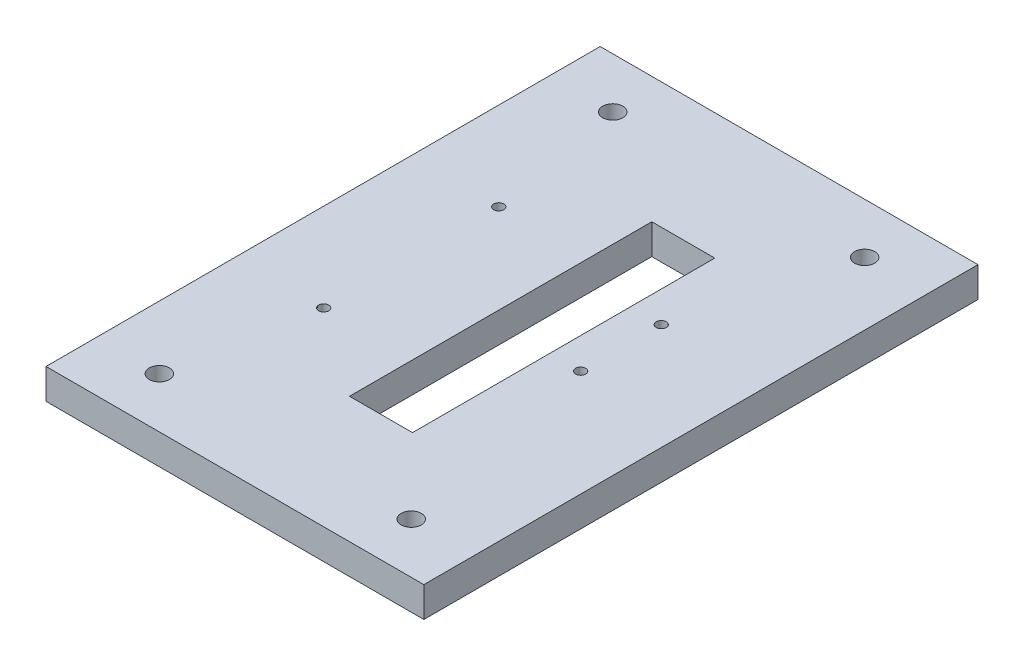
ISO-10303-21;
HEADER;
FILE_DESCRIPTION(('STEP AP214'),'2;1');
FILE_NAME('part.step','',(''),(''),'','','');
FILE_SCHEMA(('AUTOMOTIVE_DESIGN { 1 0 10303 214 1 1 1 1 }'));
ENDSEC;
DATA;
#1=APPLICATION_CONTEXT('core data for automotive mechanical design processes');
#2=APPLICATION_PROTOCOL_DEFINITION('international standard','automotive_design',2000,#1);
#3=PRODUCT_CONTEXT('',#1,'mechanical');
#4=PRODUCT('Part','Part','',(#3));
#5=PRODUCT_RELATED_PRODUCT_CATEGORY('part','',(#4));
#6=PRODUCT_DEFINITION_FORMATION('','',#4);
#7=PRODUCT_DEFINITION_CONTEXT('part definition',#1,'design');
#8=PRODUCT_DEFINITION('design','',#6,#7);
#9=PRODUCT_DEFINITION_SHAPE('','',#8);
#10=(LENGTH_UNIT() NAMED_UNIT(*) SI_UNIT(.MILLI.,.METRE.));
#11=(NAMED_UNIT(*) PLANE_ANGLE_UNIT() SI_UNIT($,.RADIAN.));
#12=(NAMED_UNIT(*) SI_UNIT($,.STERADIAN.) SOLID_ANGLE_UNIT());
#13=UNCERTAINTY_MEASURE_WITH_UNIT(LENGTH_MEASURE(1.E-05),#10,'distance_accuracy_value','');
#14=(GEOMETRIC_REPRESENTATION_CONTEXT(3) GLOBAL_UNCERTAINTY_ASSIGNED_CONTEXT((#13)) GLOBAL_UNIT_ASSIGNED_CONTEXT((#10,
#11,#12)) REPRESENTATION_CONTEXT('',''));
#15=CARTESIAN_POINT('',(0.,0.,0.));
#16=DIRECTION('',(0.,0.,1.));
#17=DIRECTION('',(1.,0.,0.));
#18=AXIS2_PLACEMENT_3D('',#15,#16,#17);
#19=CARTESIAN_POINT('',(20.5,12.,0.));
#20=DIRECTION('',(-1.,0.,0.));
#21=DIRECTION('',(0.,0.,1.));
#22=AXIS2_PLACEMENT_3D('',#19,#20,#21);
#23=PLANE('',#22);
#24=DIRECTION('',(0.,0.,-1.));
#25=VECTOR('',#24,1.);
#26=CARTESIAN_POINT('',(20.5,0.,0.));
#27=LINE('',#26,#25);
#28=CARTESIAN_POINT('',(20.5,0.,60.));
#29=VERTEX_POINT('',#28);
#30=CARTESIAN_POINT('',(20.5,0.,-60.));
#31=VERTEX_POINT('',#30);
#32=EDGE_CURVE('E165',#29,#31,#27,.T.);
#33=ORIENTED_EDGE('',*,*,#32,.F.);
#34=DIRECTION('',(0.,-1.,0.));
#35=VECTOR('',#34,1.);
#36=CARTESIAN_POINT('',(20.5,12.,60.));
#37=LINE('',#36,#35);
#38=CARTESIAN_POINT('',(20.5,12.,60.));
#39=VERTEX_POINT('',#38);
#40=EDGE_CURVE('E11',#39,#29,#37,.T.);
#41=ORIENTED_EDGE('',*,*,#40,.F.);
#42=DIRECTION('',(0.,0.,-1.));
#43=VECTOR('',#42,1.);
#44=CARTESIAN_POINT('',(20.5,12.,0.));
#45=LINE('',#44,#43);
#46=CARTESIAN_POINT('',(20.5,12.,-60.));
#47=VERTEX_POINT('',#46);
#48=EDGE_CURVE('E126',#39,#47,#45,.T.);
#49=ORIENTED_EDGE('',*,*,#48,.T.);
#50=DIRECTION('',(0.,-1.,0.));
#51=VECTOR('',#50,1.);
#52=CARTESIAN_POINT('',(20.5,12.,-60.));
#53=LINE('',#52,#51);
#54=EDGE_CURVE('E87',#47,#31,#53,.T.);
#55=ORIENTED_EDGE('',*,*,#54,.T.);
#56=EDGE_LOOP('',(#33,#41,#49,#55));
#57=FACE_BOUND('',#56,.T.);
#58=ADVANCED_FACE('F33',(#57),#23,.T.);
#59=CARTESIAN_POINT('',(0.,12.,60.));
#60=DIRECTION('',(0.,0.,-1.));
#61=DIRECTION('',(-1.,0.,0.));
#62=AXIS2_PLACEMENT_3D('',#59,#60,#61);
#63=PLANE('',#62);
#64=DIRECTION('',(1.,0.,0.));
#65=VECTOR('',#64,1.);
#66=CARTESIAN_POINT('',(0.,0.,60.));
#67=LINE('',#66,#65);
#68=CARTESIAN_POINT('',(-4.5,0.,60.));
#69=VERTEX_POINT('',#68);
#70=EDGE_CURVE('E116',#69,#29,#67,.T.);
#71=ORIENTED_EDGE('',*,*,#70,.F.);
#72=DIRECTION('',(0.,-1.,0.));
#73=VECTOR('',#72,1.);
#74=CARTESIAN_POINT('',(-4.5,12.,60.));
#75=LINE('',#74,#73);
#76=CARTESIAN_POINT('',(-4.5,12.,60.));
#77=VERTEX_POINT('',#76);
#78=EDGE_CURVE('E43',#77,#69,#75,.T.);
#79=ORIENTED_EDGE('',*,*,#78,.F.);
#80=DIRECTION('',(1.,0.,0.));
#81=VECTOR('',#80,1.);
#82=CARTESIAN_POINT('',(0.,12.,60.));
#83=LINE('',#82,#81);
#84=EDGE_CURVE('E114',#77,#39,#83,.T.);
#85=ORIENTED_EDGE('',*,*,#84,.T.);
#86=ORIENTED_EDGE('',*,*,#40,.T.);
#87=EDGE_LOOP('',(#71,#79,#85,#86));
#88=FACE_BOUND('',#87,.T.);
#89=ADVANCED_FACE('F112',(#88),#63,.T.);
#90=CARTESIAN_POINT('',(-4.5,12.,0.));
#91=DIRECTION('',(-1.,0.,0.));
#92=DIRECTION('',(0.,0.,1.));
#93=AXIS2_PLACEMENT_3D('',#90,#91,#92);
#94=PLANE('',#93);
#95=DIRECTION('',(0.,0.,-1.));
#96=VECTOR('',#95,1.);
#97=CARTESIAN_POINT('',(-4.5,0.,0.));
#98=LINE('',#97,#96);
#99=CARTESIAN_POINT('',(-4.5,0.,-60.));
#100=VERTEX_POINT('',#99);
#101=EDGE_CURVE('E168',#69,#100,#98,.T.);
#102=ORIENTED_EDGE('',*,*,#101,.T.);
#103=DIRECTION('',(0.,-1.,0.));
#104=VECTOR('',#103,1.);
#105=CARTESIAN_POINT('',(-4.5,12.,-60.));
#106=LINE('',#105,#104);
#107=CARTESIAN_POINT('',(-4.5,12.,-60.));
#108=VERTEX_POINT('',#107);
#109=EDGE_CURVE('E119',#108,#100,#106,.T.);
#110=ORIENTED_EDGE('',*,*,#109,.F.);
#111=DIRECTION('',(0.,0.,-1.));
#112=VECTOR('',#111,1.);
#113=CARTESIAN_POINT('',(-4.5,12.,0.));
#114=LINE('',#113,#112);
#115=EDGE_CURVE('E122',#77,#108,#114,.T.);
#116=ORIENTED_EDGE('',*,*,#115,.F.);
#117=ORIENTED_EDGE('',*,*,#78,.T.);
#118=EDGE_LOOP('',(#102,#110,#116,#117));
#119=FACE_BOUND('',#118,.T.);
#120=ADVANCED_FACE('F123',(#119),#94,.F.);
#121=CARTESIAN_POINT('',(0.,12.,-110.));
#122=DIRECTION('',(0.,0.,1.));
#123=DIRECTION('',(1.,0.,0.));
#124=AXIS2_PLACEMENT_3D('',#121,#122,#123);
#125=PLANE('',#124);
#126=DIRECTION('',(-1.,0.,0.));
#127=VECTOR('',#126,1.);
#128=CARTESIAN_POINT('',(0.,0.,-110.));
#129=LINE('',#128,#127);
#130=CARTESIAN_POINT('',(75.,0.,-110.));
#131=VERTEX_POINT('',#130);
#132=CARTESIAN_POINT('',(-75.,0.,-110.));
#133=VERTEX_POINT('',#132);
#134=EDGE_CURVE('E147',#131,#133,#129,.T.);
#135=ORIENTED_EDGE('',*,*,#134,.T.);
#136=DIRECTION('',(0.,-1.,0.));
#137=VECTOR('',#136,1.);
#138=CARTESIAN_POINT('',(-75.,12.,-110.));
#139=LINE('',#138,#137);
#140=CARTESIAN_POINT('',(-75.,12.,-110.));
#141=VERTEX_POINT('',#140);
#142=EDGE_CURVE('E37',#141,#133,#139,.T.);
#143=ORIENTED_EDGE('',*,*,#142,.F.);
#144=DIRECTION('',(-1.,0.,0.));
#145=VECTOR('',#144,1.);
#146=CARTESIAN_POINT('',(0.,12.,-110.));
#147=LINE('',#146,#145);
#148=CARTESIAN_POINT('',(75.,12.,-110.));
#149=VERTEX_POINT('',#148);
#150=EDGE_CURVE('E381',#149,#141,#147,.T.);
#151=ORIENTED_EDGE('',*,*,#150,.F.);
#152=DIRECTION('',(0.,-1.,0.));
#153=VECTOR('',#152,1.);
#154=CARTESIAN_POINT('',(75.,12.,-110.));
#155=LINE('',#154,#153);
#156=EDGE_CURVE('E133',#149,#131,#155,.T.);
#157=ORIENTED_EDGE('',*,*,#156,.T.);
#158=EDGE_LOOP('',(#135,#143,#151,#157));
#159=FACE_BOUND('',#158,.T.);
#160=ADVANCED_FACE('F185',(#159),#125,.F.);
#161=CARTESIAN_POINT('',(-75.,12.,0.));
#162=DIRECTION('',(1.,0.,0.));
#163=DIRECTION('',(0.,0.,-1.));
#164=AXIS2_PLACEMENT_3D('',#161,#162,#163);
#165=PLANE('',#164);
#166=DIRECTION('',(0.,0.,1.));
#167=VECTOR('',#166,1.);
#168=CARTESIAN_POINT('',(-75.,0.,0.));
#169=LINE('',#168,#167);
#170=CARTESIAN_POINT('',(-75.,0.,110.));
#171=VERTEX_POINT('',#170);
#172=EDGE_CURVE('E150',#133,#171,#169,.T.);
#173=ORIENTED_EDGE('',*,*,#172,.T.);
#174=DIRECTION('',(0.,-1.,0.));
#175=VECTOR('',#174,1.);
#176=CARTESIAN_POINT('',(-75.,12.,110.));
#177=LINE('',#176,#175);
#178=CARTESIAN_POINT('',(-75.,12.,110.));
#179=VERTEX_POINT('',#178);
#180=EDGE_CURVE('E176',#179,#171,#177,.T.);
#181=ORIENTED_EDGE('',*,*,#180,.F.);
#182=DIRECTION('',(0.,0.,1.));
#183=VECTOR('',#182,1.);
#184=CARTESIAN_POINT('',(-75.,12.,0.));
#185=LINE('',#184,#183);
#186=EDGE_CURVE('E95',#141,#179,#185,.T.);
#187=ORIENTED_EDGE('',*,*,#186,.F.);
#188=ORIENTED_EDGE('',*,*,#142,.T.);
#189=EDGE_LOOP('',(#173,#181,#187,#188));
#190=FACE_BOUND('',#189,.T.);
#191=ADVANCED_FACE('F181',(#190),#165,.F.);
#192=CARTESIAN_POINT('',(0.,12.,110.));
#193=DIRECTION('',(0.,0.,1.));
#194=DIRECTION('',(1.,0.,0.));
#195=AXIS2_PLACEMENT_3D('',#192,#193,#194);
#196=PLANE('',#195);
#197=DIRECTION('',(-1.,0.,0.));
#198=VECTOR('',#197,1.);
#199=CARTESIAN_POINT('',(0.,0.,110.));
#200=LINE('',#199,#198);
#201=CARTESIAN_POINT('',(75.,0.,110.));
#202=VERTEX_POINT('',#201);
#203=EDGE_CURVE('E153',#202,#171,#200,.T.);
#204=ORIENTED_EDGE('',*,*,#203,.F.);
#205=DIRECTION('',(0.,-1.,0.));
#206=VECTOR('',#205,1.);
#207=CARTESIAN_POINT('',(75.,12.,110.));
#208=LINE('',#207,#206);
#209=CARTESIAN_POINT('',(75.,12.,110.));
#210=VERTEX_POINT('',#209);
#211=EDGE_CURVE('E175',#210,#202,#208,.T.);
#212=ORIENTED_EDGE('',*,*,#211,.F.);
#213=DIRECTION('',(-1.,0.,0.));
#214=VECTOR('',#213,1.);
#215=CARTESIAN_POINT('',(0.,12.,110.));
#216=LINE('',#215,#214);
#217=EDGE_CURVE('E384',#210,#179,#216,.T.);
#218=ORIENTED_EDGE('',*,*,#217,.T.);
#219=ORIENTED_EDGE('',*,*,#180,.T.);
#220=EDGE_LOOP('',(#204,#212,#218,#219));
#221=FACE_BOUND('',#220,.T.);
#222=ADVANCED_FACE('F196',(#221),#196,.T.);
#223=CARTESIAN_POINT('',(-40.,12.,-34.75));
#224=DIRECTION('',(0.,-1.,0.));
#225=DIRECTION('',(0.,0.,-1.));
#226=AXIS2_PLACEMENT_3D('',#223,#224,#225);
#227=CYLINDRICAL_SURFACE('',#226,2.);
#228=CARTESIAN_POINT('',(-40.,12.,-34.75));
#229=DIRECTION('',(0.,1.,0.));
#230=DIRECTION('',(0.,0.,1.));
#231=AXIS2_PLACEMENT_3D('',#228,#229,#230);
#232=CIRCLE('',#231,2.);
#233=CARTESIAN_POINT('',(-40.,12.,-32.75));
#234=VERTEX_POINT('',#233);
#235=EDGE_CURVE('E128',#234,#234,#232,.T.);
#236=ORIENTED_EDGE('',*,*,#235,.T.);
#237=EDGE_LOOP('',(#236));
#238=FACE_BOUND('',#237,.T.);
#239=CARTESIAN_POINT('',(-40.,0.,-34.75));
#240=DIRECTION('',(0.,1.,0.));
#241=DIRECTION('',(0.,0.,1.));
#242=AXIS2_PLACEMENT_3D('',#239,#240,#241);
#243=CIRCLE('',#242,2.);
#244=CARTESIAN_POINT('',(-40.,0.,-32.75));
#245=VERTEX_POINT('',#244);
#246=EDGE_CURVE('E162',#245,#245,#243,.T.);
#247=ORIENTED_EDGE('',*,*,#246,.F.);
#248=EDGE_LOOP('',(#247));
#249=FACE_BOUND('',#248,.T.);
#250=ADVANCED_FACE('F198',(#238,#249),#227,.F.);
#251=CARTESIAN_POINT('',(-40.,12.,34.75));
#252=DIRECTION('',(0.,-1.,0.));
#253=DIRECTION('',(0.,0.,-1.));
#254=AXIS2_PLACEMENT_3D('',#251,#252,#253);
#255=CYLINDRICAL_SURFACE('',#254,2.);
#256=CARTESIAN_POINT('',(-40.,12.,34.75));
#257=DIRECTION('',(0.,1.,0.));
#258=DIRECTION('',(0.,0.,1.));
#259=AXIS2_PLACEMENT_3D('',#256,#257,#258);
#260=CIRCLE('',#259,2.);
#261=CARTESIAN_POINT('',(-40.,12.,36.75));
#262=VERTEX_POINT('',#261);
#263=EDGE_CURVE('E387',#262,#262,#260,.T.);
#264=ORIENTED_EDGE('',*,*,#263,.T.);
#265=EDGE_LOOP('',(#264));
#266=FACE_BOUND('',#265,.T.);
#267=CARTESIAN_POINT('',(-40.,0.,34.75));
#268=DIRECTION('',(0.,1.,0.));
#269=DIRECTION('',(0.,0.,1.));
#270=AXIS2_PLACEMENT_3D('',#267,#268,#269);
#271=CIRCLE('',#270,2.);
#272=CARTESIAN_POINT('',(-40.,0.,36.75));
#273=VERTEX_POINT('',#272);
#274=EDGE_CURVE('E159',#273,#273,#271,.T.);
#275=ORIENTED_EDGE('',*,*,#274,.F.);
#276=EDGE_LOOP('',(#275));
#277=FACE_BOUND('',#276,.T.);
#278=ADVANCED_FACE('F204',(#266,#277),#255,.F.);
#279=CARTESIAN_POINT('',(75.,12.,0.));
#280=DIRECTION('',(1.,0.,0.));
#281=DIRECTION('',(0.,0.,-1.));
#282=AXIS2_PLACEMENT_3D('',#279,#280,#281);
#283=PLANE('',#282);
#284=DIRECTION('',(0.,0.,1.));
#285=VECTOR('',#284,1.);
#286=CARTESIAN_POINT('',(75.,0.,0.));
#287=LINE('',#286,#285);
#288=EDGE_CURVE('E156',#131,#202,#287,.T.);
#289=ORIENTED_EDGE('',*,*,#288,.F.);
#290=ORIENTED_EDGE('',*,*,#156,.F.);
#291=DIRECTION('',(0.,0.,1.));
#292=VECTOR('',#291,1.);
#293=CARTESIAN_POINT('',(75.,12.,0.));
#294=LINE('',#293,#292);
#295=EDGE_CURVE('E194',#149,#210,#294,.T.);
#296=ORIENTED_EDGE('',*,*,#295,.T.);
#297=ORIENTED_EDGE('',*,*,#211,.T.);
#298=EDGE_LOOP('',(#289,#290,#296,#297));
#299=FACE_BOUND('',#298,.T.);
#300=ADVANCED_FACE('F191',(#299),#283,.T.);
#301=CARTESIAN_POINT('',(-50.,12.,-90.));
#302=DIRECTION('',(0.,-1.,0.));
#303=DIRECTION('',(0.,0.,-1.));
#304=AXIS2_PLACEMENT_3D('',#301,#302,#303);
#305=CYLINDRICAL_SURFACE('',#304,4.);
#306=CARTESIAN_POINT('',(-50.,12.,-90.));
#307=DIRECTION('',(0.,1.,0.));
#308=DIRECTION('',(0.,0.,1.));
#309=AXIS2_PLACEMENT_3D('',#306,#307,#308);
#310=CIRCLE('',#309,4.);
#311=CARTESIAN_POINT('',(-50.,12.,-86.));
#312=VERTEX_POINT('',#311);
#313=EDGE_CURVE('E379',#312,#312,#310,.T.);
#314=ORIENTED_EDGE('',*,*,#313,.T.);
#315=EDGE_LOOP('',(#314));
#316=FACE_BOUND('',#315,.T.);
#317=CARTESIAN_POINT('',(-50.,0.,-90.));
#318=DIRECTION('',(0.,1.,0.));
#319=DIRECTION('',(0.,0.,1.));
#320=AXIS2_PLACEMENT_3D('',#317,#318,#319);
#321=CIRCLE('',#320,4.);
#322=CARTESIAN_POINT('',(-50.,0.,-86.));
#323=VERTEX_POINT('',#322);
#324=EDGE_CURVE('E144',#323,#323,#321,.T.);
#325=ORIENTED_EDGE('',*,*,#324,.F.);
#326=EDGE_LOOP('',(#325));
#327=FACE_BOUND('',#326,.T.);
#328=ADVANCED_FACE('F220',(#316,#327),#305,.F.);
#329=CARTESIAN_POINT('',(50.,12.,-90.));
#330=DIRECTION('',(0.,-1.,0.));
#331=DIRECTION('',(0.,0.,-1.));
#332=AXIS2_PLACEMENT_3D('',#329,#330,#331);
#333=CYLINDRICAL_SURFACE('',#332,4.00000000000001);
#334=CARTESIAN_POINT('',(50.,12.,-90.));
#335=DIRECTION('',(0.,1.,0.));
#336=DIRECTION('',(0.,0.,1.));
#337=AXIS2_PLACEMENT_3D('',#334,#335,#336);
#338=CIRCLE('',#337,4.00000000000001);
#339=CARTESIAN_POINT('',(50.,12.,-86.));
#340=VERTEX_POINT('',#339);
#341=EDGE_CURVE('E376',#340,#340,#338,.T.);
#342=ORIENTED_EDGE('',*,*,#341,.T.);
#343=EDGE_LOOP('',(#342));
#344=FACE_BOUND('',#343,.T.);
#345=CARTESIAN_POINT('',(50.,0.,-90.));
#346=DIRECTION('',(0.,1.,0.));
#347=DIRECTION('',(0.,0.,1.));
#348=AXIS2_PLACEMENT_3D('',#345,#346,#347);
#349=CIRCLE('',#348,4.00000000000001);
#350=CARTESIAN_POINT('',(50.,0.,-86.));
#351=VERTEX_POINT('',#350);
#352=EDGE_CURVE('E141',#351,#351,#349,.T.);
#353=ORIENTED_EDGE('',*,*,#352,.F.);
#354=EDGE_LOOP('',(#353));
#355=FACE_BOUND('',#354,.T.);
#356=ADVANCED_FACE('F224',(#344,#355),#333,.F.);
#357=CARTESIAN_POINT('',(-50.,12.,90.));
#358=DIRECTION('',(0.,-1.,0.));
#359=DIRECTION('',(0.,0.,-1.));
#360=AXIS2_PLACEMENT_3D('',#357,#358,#359);
#361=CYLINDRICAL_SURFACE('',#360,4.);
#362=CARTESIAN_POINT('',(-50.,12.,90.));
#363=DIRECTION('',(0.,1.,0.));
#364=DIRECTION('',(0.,0.,1.));
#365=AXIS2_PLACEMENT_3D('',#362,#363,#364);
#366=CIRCLE('',#365,4.);
#367=CARTESIAN_POINT('',(-50.,12.,94.));
#368=VERTEX_POINT('',#367);
#369=EDGE_CURVE('E246',#368,#368,#366,.T.);
#370=ORIENTED_EDGE('',*,*,#369,.T.);
#371=EDGE_LOOP('',(#370));
#372=FACE_BOUND('',#371,.T.);
#373=CARTESIAN_POINT('',(-50.,0.,90.));
#374=DIRECTION('',(0.,1.,0.));
#375=DIRECTION('',(0.,0.,1.));
#376=AXIS2_PLACEMENT_3D('',#373,#374,#375);
#377=CIRCLE('',#376,4.);
#378=CARTESIAN_POINT('',(-50.,0.,94.));
#379=VERTEX_POINT('',#378);
#380=EDGE_CURVE('E137',#379,#379,#377,.T.);
#381=ORIENTED_EDGE('',*,*,#380,.F.);
#382=EDGE_LOOP('',(#381));
#383=FACE_BOUND('',#382,.T.);
#384=ADVANCED_FACE('F230',(#372,#383),#361,.F.);
#385=CARTESIAN_POINT('',(50.,12.,90.));
#386=DIRECTION('',(0.,-1.,0.));
#387=DIRECTION('',(0.,0.,-1.));
#388=AXIS2_PLACEMENT_3D('',#385,#386,#387);
#389=CYLINDRICAL_SURFACE('',#388,4.);
#390=CARTESIAN_POINT('',(50.,12.,90.));
#391=DIRECTION('',(0.,1.,0.));
#392=DIRECTION('',(0.,0.,1.));
#393=AXIS2_PLACEMENT_3D('',#390,#391,#392);
#394=CIRCLE('',#393,4.);
#395=CARTESIAN_POINT('',(50.,12.,94.));
#396=VERTEX_POINT('',#395);
#397=EDGE_CURVE('E171',#396,#396,#394,.T.);
#398=ORIENTED_EDGE('',*,*,#397,.T.);
#399=EDGE_LOOP('',(#398));
#400=FACE_BOUND('',#399,.T.);
#401=CARTESIAN_POINT('',(50.,0.,90.));
#402=DIRECTION('',(0.,1.,0.));
#403=DIRECTION('',(0.,0.,1.));
#404=AXIS2_PLACEMENT_3D('',#401,#402,#403);
#405=CIRCLE('',#404,4.);
#406=CARTESIAN_POINT('',(50.,0.,94.));
#407=VERTEX_POINT('',#406);
#408=EDGE_CURVE('E134',#407,#407,#405,.T.);
#409=ORIENTED_EDGE('',*,*,#408,.F.);
#410=EDGE_LOOP('',(#409));
#411=FACE_BOUND('',#410,.T.);
#412=ADVANCED_FACE('F35',(#400,#411),#389,.F.);
#413=CARTESIAN_POINT('',(0.,12.,-60.));
#414=DIRECTION('',(0.,0.,-1.));
#415=DIRECTION('',(-1.,0.,0.));
#416=AXIS2_PLACEMENT_3D('',#413,#414,#415);
#417=PLANE('',#416);
#418=DIRECTION('',(1.,0.,0.));
#419=VECTOR('',#418,1.);
#420=CARTESIAN_POINT('',(0.,0.,-60.));
#421=LINE('',#420,#419);
#422=EDGE_CURVE('E80',#100,#31,#421,.T.);
#423=ORIENTED_EDGE('',*,*,#422,.T.);
#424=ORIENTED_EDGE('',*,*,#54,.F.);
#425=DIRECTION('',(1.,0.,0.));
#426=VECTOR('',#425,1.);
#427=CARTESIAN_POINT('',(0.,12.,-60.));
#428=LINE('',#427,#426);
#429=EDGE_CURVE('E52',#108,#47,#428,.T.);
#430=ORIENTED_EDGE('',*,*,#429,.F.);
#431=ORIENTED_EDGE('',*,*,#109,.T.);
#432=EDGE_LOOP('',(#423,#424,#430,#431));
#433=FACE_BOUND('',#432,.T.);
#434=ADVANCED_FACE('F241',(#433),#417,.F.);
#435=CARTESIAN_POINT('',(0.,12.,0.));
#436=DIRECTION('',(0.,1.,0.));
#437=DIRECTION('',(0.,0.,1.));
#438=AXIS2_PLACEMENT_3D('',#435,#436,#437);
#439=PLANE('',#438);
#440=CARTESIAN_POINT('',(32.75,12.,-26.4999999999992));
#441=DIRECTION('',(0.,1.,0.));
#442=DIRECTION('',(0.,0.,1.));
#443=AXIS2_PLACEMENT_3D('',#440,#441,#442);
#444=CIRCLE('',#443,2.);
#445=CARTESIAN_POINT('',(32.75,12.,-24.4999999999991));
#446=VERTEX_POINT('',#445);
#447=EDGE_CURVE('E363',#446,#446,#444,.T.);
#448=ORIENTED_EDGE('',*,*,#447,.F.);
#449=EDGE_LOOP('',(#448));
#450=FACE_BOUND('',#449,.T.);
#451=CARTESIAN_POINT('',(32.75,12.,5.50000000000086));
#452=DIRECTION('',(0.,1.,0.));
#453=DIRECTION('',(0.,0.,1.));
#454=AXIS2_PLACEMENT_3D('',#451,#452,#453);
#455=CIRCLE('',#454,2.);
#456=CARTESIAN_POINT('',(32.75,12.,7.50000000000085));
#457=VERTEX_POINT('',#456);
#458=EDGE_CURVE('E368',#457,#457,#455,.T.);
#459=ORIENTED_EDGE('',*,*,#458,.F.);
#460=EDGE_LOOP('',(#459));
#461=FACE_BOUND('',#460,.T.);
#462=ORIENTED_EDGE('',*,*,#397,.F.);
#463=EDGE_LOOP('',(#462));
#464=FACE_BOUND('',#463,.T.);
#465=ORIENTED_EDGE('',*,*,#369,.F.);
#466=EDGE_LOOP('',(#465));
#467=FACE_BOUND('',#466,.T.);
#468=ORIENTED_EDGE('',*,*,#341,.F.);
#469=EDGE_LOOP('',(#468));
#470=FACE_BOUND('',#469,.T.);
#471=ORIENTED_EDGE('',*,*,#313,.F.);
#472=EDGE_LOOP('',(#471));
#473=FACE_BOUND('',#472,.T.);
#474=ORIENTED_EDGE('',*,*,#150,.T.);
#475=ORIENTED_EDGE('',*,*,#186,.T.);
#476=ORIENTED_EDGE('',*,*,#217,.F.);
#477=ORIENTED_EDGE('',*,*,#295,.F.);
#478=EDGE_LOOP('',(#474,#475,#476,#477));
#479=FACE_BOUND('',#478,.T.);
#480=ORIENTED_EDGE('',*,*,#263,.F.);
#481=EDGE_LOOP('',(#480));
#482=FACE_BOUND('',#481,.T.);
#483=ORIENTED_EDGE('',*,*,#235,.F.);
#484=EDGE_LOOP('',(#483));
#485=FACE_BOUND('',#484,.T.);
#486=ORIENTED_EDGE('',*,*,#48,.F.);
#487=ORIENTED_EDGE('',*,*,#84,.F.);
#488=ORIENTED_EDGE('',*,*,#115,.T.);
#489=ORIENTED_EDGE('',*,*,#429,.T.);
#490=EDGE_LOOP('',(#486,#487,#488,#489));
#491=FACE_BOUND('',#490,.T.);
#492=ADVANCED_FACE('F125',(#450,#461,#464,#467,#470,#473,#479,#482,#485,#491),#439,.T.);
#493=CARTESIAN_POINT('',(0.,0.,0.));
#494=DIRECTION('',(0.,1.,0.));
#495=DIRECTION('',(0.,0.,1.));
#496=AXIS2_PLACEMENT_3D('',#493,#494,#495);
#497=PLANE('',#496);
#498=CARTESIAN_POINT('',(32.75,0.,-26.4999999999992));
#499=DIRECTION('',(0.,1.,0.));
#500=DIRECTION('',(0.,0.,1.));
#501=AXIS2_PLACEMENT_3D('',#498,#499,#500);
#502=CIRCLE('',#501,2.);
#503=CARTESIAN_POINT('',(32.75,0.,-24.4999999999991));
#504=VERTEX_POINT('',#503);
#505=EDGE_CURVE('E138',#504,#504,#502,.F.);
#506=ORIENTED_EDGE('',*,*,#505,.F.);
#507=EDGE_LOOP('',(#506));
#508=FACE_BOUND('',#507,.T.);
#509=CARTESIAN_POINT('',(32.75,0.,5.50000000000086));
#510=DIRECTION('',(0.,1.,0.));
#511=DIRECTION('',(0.,0.,1.));
#512=AXIS2_PLACEMENT_3D('',#509,#510,#511);
#513=CIRCLE('',#512,2.);
#514=CARTESIAN_POINT('',(32.75,0.,7.50000000000085));
#515=VERTEX_POINT('',#514);
#516=EDGE_CURVE('E364',#515,#515,#513,.F.);
#517=ORIENTED_EDGE('',*,*,#516,.F.);
#518=EDGE_LOOP('',(#517));
#519=FACE_BOUND('',#518,.T.);
#520=ORIENTED_EDGE('',*,*,#408,.T.);
#521=EDGE_LOOP('',(#520));
#522=FACE_BOUND('',#521,.T.);
#523=ORIENTED_EDGE('',*,*,#380,.T.);
#524=EDGE_LOOP('',(#523));
#525=FACE_BOUND('',#524,.T.);
#526=ORIENTED_EDGE('',*,*,#352,.T.);
#527=EDGE_LOOP('',(#526));
#528=FACE_BOUND('',#527,.T.);
#529=ORIENTED_EDGE('',*,*,#324,.T.);
#530=EDGE_LOOP('',(#529));
#531=FACE_BOUND('',#530,.T.);
#532=ORIENTED_EDGE('',*,*,#134,.F.);
#533=ORIENTED_EDGE('',*,*,#288,.T.);
#534=ORIENTED_EDGE('',*,*,#203,.T.);
#535=ORIENTED_EDGE('',*,*,#172,.F.);
#536=EDGE_LOOP('',(#532,#533,#534,#535));
#537=FACE_BOUND('',#536,.T.);
#538=ORIENTED_EDGE('',*,*,#274,.T.);
#539=EDGE_LOOP('',(#538));
#540=FACE_BOUND('',#539,.T.);
#541=ORIENTED_EDGE('',*,*,#246,.T.);
#542=EDGE_LOOP('',(#541));
#543=FACE_BOUND('',#542,.T.);
#544=ORIENTED_EDGE('',*,*,#32,.T.);
#545=ORIENTED_EDGE('',*,*,#422,.F.);
#546=ORIENTED_EDGE('',*,*,#101,.F.);
#547=ORIENTED_EDGE('',*,*,#70,.T.);
#548=EDGE_LOOP('',(#544,#545,#546,#547));
#549=FACE_BOUND('',#548,.T.);
#550=ADVANCED_FACE('F188',(#508,#519,#522,#525,#528,#531,#537,#540,#543,#549),#497,.F.);
#551=CARTESIAN_POINT('',(32.75,-5.65685424949238,5.50000000000086));
#552=DIRECTION('',(0.,1.,0.));
#553=DIRECTION('',(0.,0.,1.));
#554=AXIS2_PLACEMENT_3D('',#551,#552,#553);
#555=CYLINDRICAL_SURFACE('',#554,2.);
#556=ORIENTED_EDGE('',*,*,#516,.T.);
#557=EDGE_LOOP('',(#556));
#558=FACE_BOUND('',#557,.T.);
#559=ORIENTED_EDGE('',*,*,#458,.T.);
#560=EDGE_LOOP('',(#559));
#561=FACE_BOUND('',#560,.T.);
#562=ADVANCED_FACE('F251',(#558,#561),#555,.F.);
#563=CARTESIAN_POINT('',(32.75,-5.65685424949238,-26.4999999999992));
#564=DIRECTION('',(0.,1.,0.));
#565=DIRECTION('',(0.,0.,1.));
#566=AXIS2_PLACEMENT_3D('',#563,#564,#565);
#567=CYLINDRICAL_SURFACE('',#566,2.);
#568=ORIENTED_EDGE('',*,*,#505,.T.);
#569=EDGE_LOOP('',(#568));
#570=FACE_BOUND('',#569,.T.);
#571=ORIENTED_EDGE('',*,*,#447,.T.);
#572=EDGE_LOOP('',(#571));
#573=FACE_BOUND('',#572,.T.);
#574=ADVANCED_FACE('F262',(#570,#573),#567,.F.);
#575=CLOSED_SHELL('',(#58,#89,#120,#160,#191,#222,#250,#278,#300,#328,#356,#384,#412,#434,#492,
#550,#562,#574));
#576=MANIFOLD_SOLID_BREP('B2',#575);
#577=ADVANCED_BREP_SHAPE_REPRESENTATION('',(#18,#576),#14);
#578=SHAPE_DEFINITION_REPRESENTATION(#9,#577);
ENDSEC;
END-ISO-10303-21;
